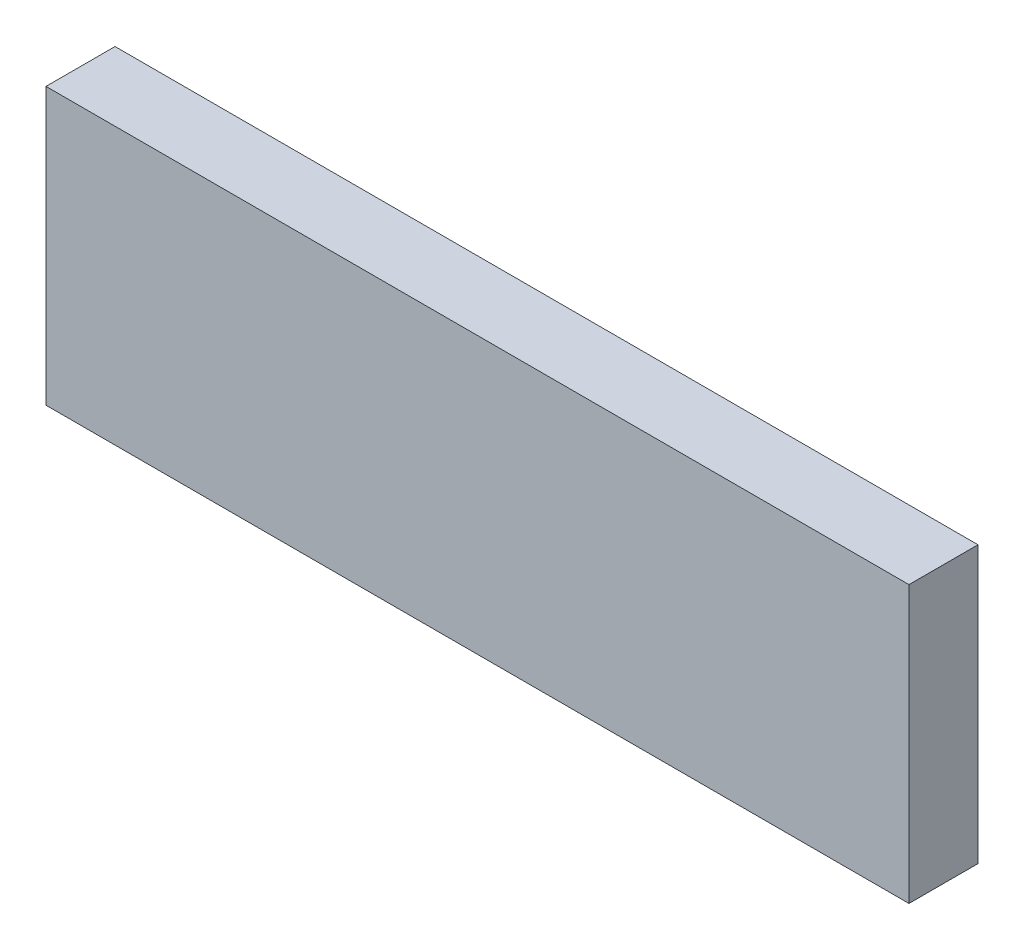
ISO-10303-21;
HEADER;
FILE_DESCRIPTION(('STEP AP214'),'2;1');
FILE_NAME('part.step','',(''),(''),'','','');
FILE_SCHEMA(('AUTOMOTIVE_DESIGN { 1 0 10303 214 1 1 1 1 }'));
ENDSEC;
DATA;
#1=APPLICATION_CONTEXT('core data for automotive mechanical design processes');
#2=APPLICATION_PROTOCOL_DEFINITION('international standard','automotive_design',2000,#1);
#3=PRODUCT_CONTEXT('',#1,'mechanical');
#4=PRODUCT('Part','Part','',(#3));
#5=PRODUCT_RELATED_PRODUCT_CATEGORY('part','',(#4));
#6=PRODUCT_DEFINITION_FORMATION('','',#4);
#7=PRODUCT_DEFINITION_CONTEXT('part definition',#1,'design');
#8=PRODUCT_DEFINITION('design','',#6,#7);
#9=PRODUCT_DEFINITION_SHAPE('','',#8);
#10=(LENGTH_UNIT() NAMED_UNIT(*) SI_UNIT(.MILLI.,.METRE.));
#11=(NAMED_UNIT(*) PLANE_ANGLE_UNIT() SI_UNIT($,.RADIAN.));
#12=(NAMED_UNIT(*) SI_UNIT($,.STERADIAN.) SOLID_ANGLE_UNIT());
#13=UNCERTAINTY_MEASURE_WITH_UNIT(LENGTH_MEASURE(1.E-05),#10,'distance_accuracy_value','');
#14=(GEOMETRIC_REPRESENTATION_CONTEXT(3) GLOBAL_UNCERTAINTY_ASSIGNED_CONTEXT((#13)) GLOBAL_UNIT_ASSIGNED_CONTEXT((#10,
#11,#12)) REPRESENTATION_CONTEXT('',''));
#15=CARTESIAN_POINT('',(0.,0.,0.));
#16=DIRECTION('',(0.,0.,1.));
#17=DIRECTION('',(1.,0.,0.));
#18=AXIS2_PLACEMENT_3D('',#15,#16,#17);
#19=CARTESIAN_POINT('',(125.,-40.,20.));
#20=DIRECTION('',(-1.,0.,0.));
#21=DIRECTION('',(0.,0.,1.));
#22=AXIS2_PLACEMENT_3D('',#19,#20,#21);
#23=PLANE('',#22);
#24=DIRECTION('',(0.,1.,0.));
#25=VECTOR('',#24,1.);
#26=CARTESIAN_POINT('',(125.,-40.,0.));
#27=LINE('',#26,#25);
#28=CARTESIAN_POINT('',(125.,-40.,0.));
#29=VERTEX_POINT('',#28);
#30=CARTESIAN_POINT('',(125.,40.,0.));
#31=VERTEX_POINT('',#30);
#32=EDGE_CURVE('E113',#29,#31,#27,.T.);
#33=ORIENTED_EDGE('',*,*,#32,.T.);
#34=DIRECTION('',(0.,0.,-1.));
#35=VECTOR('',#34,1.);
#36=CARTESIAN_POINT('',(125.,40.,20.));
#37=LINE('',#36,#35);
#38=CARTESIAN_POINT('',(125.,40.,20.));
#39=VERTEX_POINT('',#38);
#40=EDGE_CURVE('E11',#39,#31,#37,.T.);
#41=ORIENTED_EDGE('',*,*,#40,.F.);
#42=DIRECTION('',(0.,1.,0.));
#43=VECTOR('',#42,1.);
#44=CARTESIAN_POINT('',(125.,-40.,20.));
#45=LINE('',#44,#43);
#46=CARTESIAN_POINT('',(125.,-40.,20.));
#47=VERTEX_POINT('',#46);
#48=EDGE_CURVE('E97',#47,#39,#45,.T.);
#49=ORIENTED_EDGE('',*,*,#48,.F.);
#50=DIRECTION('',(0.,0.,-1.));
#51=VECTOR('',#50,1.);
#52=CARTESIAN_POINT('',(125.,-40.,20.));
#53=LINE('',#52,#51);
#54=EDGE_CURVE('E109',#47,#29,#53,.T.);
#55=ORIENTED_EDGE('',*,*,#54,.T.);
#56=EDGE_LOOP('',(#33,#41,#49,#55));
#57=FACE_BOUND('',#56,.T.);
#58=ADVANCED_FACE('F45',(#57),#23,.F.);
#59=CARTESIAN_POINT('',(-125.,40.,20.));
#60=DIRECTION('',(0.,-1.,0.));
#61=DIRECTION('',(0.,0.,-1.));
#62=AXIS2_PLACEMENT_3D('',#59,#60,#61);
#63=PLANE('',#62);
#64=DIRECTION('',(-1.,0.,0.));
#65=VECTOR('',#64,1.);
#66=CARTESIAN_POINT('',(-125.,40.,0.));
#67=LINE('',#66,#65);
#68=CARTESIAN_POINT('',(-125.,40.,0.));
#69=VERTEX_POINT('',#68);
#70=EDGE_CURVE('E102',#31,#69,#67,.T.);
#71=ORIENTED_EDGE('',*,*,#70,.T.);
#72=DIRECTION('',(0.,0.,-1.));
#73=VECTOR('',#72,1.);
#74=CARTESIAN_POINT('',(-125.,40.,20.));
#75=LINE('',#74,#73);
#76=CARTESIAN_POINT('',(-125.,40.,20.));
#77=VERTEX_POINT('',#76);
#78=EDGE_CURVE('E54',#77,#69,#75,.T.);
#79=ORIENTED_EDGE('',*,*,#78,.F.);
#80=DIRECTION('',(-1.,0.,0.));
#81=VECTOR('',#80,1.);
#82=CARTESIAN_POINT('',(-125.,40.,20.));
#83=LINE('',#82,#81);
#84=EDGE_CURVE('E92',#39,#77,#83,.T.);
#85=ORIENTED_EDGE('',*,*,#84,.F.);
#86=ORIENTED_EDGE('',*,*,#40,.T.);
#87=EDGE_LOOP('',(#71,#79,#85,#86));
#88=FACE_BOUND('',#87,.T.);
#89=ADVANCED_FACE('F101',(#88),#63,.F.);
#90=CARTESIAN_POINT('',(-125.,-40.,20.));
#91=DIRECTION('',(1.,0.,0.));
#92=DIRECTION('',(0.,0.,-1.));
#93=AXIS2_PLACEMENT_3D('',#90,#91,#92);
#94=PLANE('',#93);
#95=DIRECTION('',(0.,-1.,0.));
#96=VECTOR('',#95,1.);
#97=CARTESIAN_POINT('',(-125.,-40.,0.));
#98=LINE('',#97,#96);
#99=CARTESIAN_POINT('',(-125.,-40.,0.));
#100=VERTEX_POINT('',#99);
#101=EDGE_CURVE('E79',#69,#100,#98,.T.);
#102=ORIENTED_EDGE('',*,*,#101,.T.);
#103=DIRECTION('',(0.,0.,-1.));
#104=VECTOR('',#103,1.);
#105=CARTESIAN_POINT('',(-125.,-40.,20.));
#106=LINE('',#105,#104);
#107=CARTESIAN_POINT('',(-125.,-40.,20.));
#108=VERTEX_POINT('',#107);
#109=EDGE_CURVE('E104',#108,#100,#106,.T.);
#110=ORIENTED_EDGE('',*,*,#109,.F.);
#111=DIRECTION('',(0.,-1.,0.));
#112=VECTOR('',#111,1.);
#113=CARTESIAN_POINT('',(-125.,-40.,20.));
#114=LINE('',#113,#112);
#115=EDGE_CURVE('E95',#77,#108,#114,.T.);
#116=ORIENTED_EDGE('',*,*,#115,.F.);
#117=ORIENTED_EDGE('',*,*,#78,.T.);
#118=EDGE_LOOP('',(#102,#110,#116,#117));
#119=FACE_BOUND('',#118,.T.);
#120=ADVANCED_FACE('F105',(#119),#94,.F.);
#121=CARTESIAN_POINT('',(-125.,-40.,20.));
#122=DIRECTION('',(0.,1.,0.));
#123=DIRECTION('',(0.,0.,1.));
#124=AXIS2_PLACEMENT_3D('',#121,#122,#123);
#125=PLANE('',#124);
#126=DIRECTION('',(1.,0.,0.));
#127=VECTOR('',#126,1.);
#128=CARTESIAN_POINT('',(-125.,-40.,0.));
#129=LINE('',#128,#127);
#130=EDGE_CURVE('E85',#100,#29,#129,.T.);
#131=ORIENTED_EDGE('',*,*,#130,.T.);
#132=ORIENTED_EDGE('',*,*,#54,.F.);
#133=DIRECTION('',(1.,0.,0.));
#134=VECTOR('',#133,1.);
#135=CARTESIAN_POINT('',(-125.,-40.,20.));
#136=LINE('',#135,#134);
#137=EDGE_CURVE('E62',#108,#47,#136,.T.);
#138=ORIENTED_EDGE('',*,*,#137,.F.);
#139=ORIENTED_EDGE('',*,*,#109,.T.);
#140=EDGE_LOOP('',(#131,#132,#138,#139));
#141=FACE_BOUND('',#140,.T.);
#142=ADVANCED_FACE('F126',(#141),#125,.F.);
#143=CARTESIAN_POINT('',(0.,0.,20.));
#144=DIRECTION('',(0.,0.,-1.));
#145=DIRECTION('',(-1.,0.,0.));
#146=AXIS2_PLACEMENT_3D('',#143,#144,#145);
#147=PLANE('',#146);
#148=ORIENTED_EDGE('',*,*,#48,.T.);
#149=ORIENTED_EDGE('',*,*,#84,.T.);
#150=ORIENTED_EDGE('',*,*,#115,.T.);
#151=ORIENTED_EDGE('',*,*,#137,.T.);
#152=EDGE_LOOP('',(#148,#149,#150,#151));
#153=FACE_BOUND('',#152,.T.);
#154=ADVANCED_FACE('F93',(#153),#147,.F.);
#155=CARTESIAN_POINT('',(0.,0.,0.));
#156=DIRECTION('',(0.,0.,-1.));
#157=DIRECTION('',(-1.,0.,0.));
#158=AXIS2_PLACEMENT_3D('',#155,#156,#157);
#159=PLANE('',#158);
#160=ORIENTED_EDGE('',*,*,#32,.F.);
#161=ORIENTED_EDGE('',*,*,#130,.F.);
#162=ORIENTED_EDGE('',*,*,#101,.F.);
#163=ORIENTED_EDGE('',*,*,#70,.F.);
#164=EDGE_LOOP('',(#160,#161,#162,#163));
#165=FACE_BOUND('',#164,.T.);
#166=ADVANCED_FACE('F129',(#165),#159,.T.);
#167=CLOSED_SHELL('',(#58,#89,#120,#142,#154,#166));
#168=MANIFOLD_SOLID_BREP('B2',#167);
#169=ADVANCED_BREP_SHAPE_REPRESENTATION('',(#18,#168),#14);
#170=SHAPE_DEFINITION_REPRESENTATION(#9,#169);
ENDSEC;
END-ISO-10303-21;
